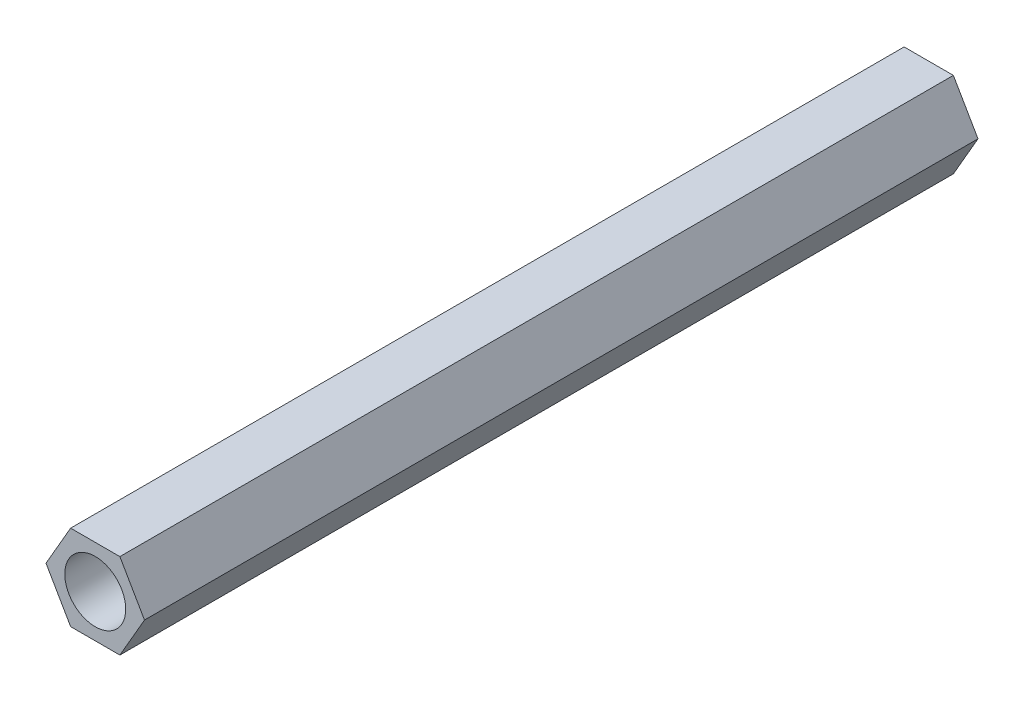
ISO-10303-21;
HEADER;
FILE_DESCRIPTION(('STEP AP214'),'2;1');
FILE_NAME('part.step','',(''),(''),'','','');
FILE_SCHEMA(('AUTOMOTIVE_DESIGN { 1 0 10303 214 1 1 1 1 }'));
ENDSEC;
DATA;
#1=APPLICATION_CONTEXT('core data for automotive mechanical design processes');
#2=APPLICATION_PROTOCOL_DEFINITION('international standard','automotive_design',2000,#1);
#3=PRODUCT_CONTEXT('',#1,'mechanical');
#4=PRODUCT('Part','Part','',(#3));
#5=PRODUCT_RELATED_PRODUCT_CATEGORY('part','',(#4));
#6=PRODUCT_DEFINITION_FORMATION('','',#4);
#7=PRODUCT_DEFINITION_CONTEXT('part definition',#1,'design');
#8=PRODUCT_DEFINITION('design','',#6,#7);
#9=PRODUCT_DEFINITION_SHAPE('','',#8);
#10=(LENGTH_UNIT() NAMED_UNIT(*) SI_UNIT(.MILLI.,.METRE.));
#11=(NAMED_UNIT(*) PLANE_ANGLE_UNIT() SI_UNIT($,.RADIAN.));
#12=(NAMED_UNIT(*) SI_UNIT($,.STERADIAN.) SOLID_ANGLE_UNIT());
#13=UNCERTAINTY_MEASURE_WITH_UNIT(LENGTH_MEASURE(1.E-05),#10,'distance_accuracy_value','');
#14=(GEOMETRIC_REPRESENTATION_CONTEXT(3) GLOBAL_UNCERTAINTY_ASSIGNED_CONTEXT((#13)) GLOBAL_UNIT_ASSIGNED_CONTEXT((#10,
#11,#12)) REPRESENTATION_CONTEXT('',''));
#15=CARTESIAN_POINT('',(0.,0.,0.));
#16=DIRECTION('',(0.,0.,1.));
#17=DIRECTION('',(1.,0.,0.));
#18=AXIS2_PLACEMENT_3D('',#15,#16,#17);
#19=CARTESIAN_POINT('',(0.,0.,34.2));
#20=DIRECTION('',(0.,0.,1.));
#21=DIRECTION('',(1.,0.,0.));
#22=AXIS2_PLACEMENT_3D('',#19,#20,#21);
#23=PLANE('',#22);
#24=DIRECTION('',(-0.5,-0.866025403784439,0.));
#25=VECTOR('',#24,1.);
#26=CARTESIAN_POINT('',(-2.02072594216369,3.5,34.2));
#27=LINE('',#26,#25);
#28=CARTESIAN_POINT('',(-2.02072594216369,3.5,34.2));
#29=VERTEX_POINT('',#28);
#30=CARTESIAN_POINT('',(-4.04145188432738,0.,34.2));
#31=VERTEX_POINT('',#30);
#32=EDGE_CURVE('E129',#29,#31,#27,.T.);
#33=ORIENTED_EDGE('',*,*,#32,.T.);
#34=DIRECTION('',(0.5,-0.866025403784439,0.));
#35=VECTOR('',#34,1.);
#36=CARTESIAN_POINT('',(-4.04145188432738,0.,34.2));
#37=LINE('',#36,#35);
#38=CARTESIAN_POINT('',(-2.02072594216369,-3.5,34.2));
#39=VERTEX_POINT('',#38);
#40=EDGE_CURVE('E87',#31,#39,#37,.T.);
#41=ORIENTED_EDGE('',*,*,#40,.T.);
#42=DIRECTION('',(1.,0.,0.));
#43=VECTOR('',#42,1.);
#44=CARTESIAN_POINT('',(-2.02072594216369,-3.5,34.2));
#45=LINE('',#44,#43);
#46=CARTESIAN_POINT('',(2.02072594216369,-3.5,34.2));
#47=VERTEX_POINT('',#46);
#48=EDGE_CURVE('E100',#39,#47,#45,.T.);
#49=ORIENTED_EDGE('',*,*,#48,.T.);
#50=DIRECTION('',(0.5,0.866025403784439,0.));
#51=VECTOR('',#50,1.);
#52=CARTESIAN_POINT('',(2.02072594216369,-3.5,34.2));
#53=LINE('',#52,#51);
#54=CARTESIAN_POINT('',(4.04145188432738,0.,34.2));
#55=VERTEX_POINT('',#54);
#56=EDGE_CURVE('E94',#47,#55,#53,.T.);
#57=ORIENTED_EDGE('',*,*,#56,.T.);
#58=DIRECTION('',(-0.5,0.866025403784439,0.));
#59=VECTOR('',#58,1.);
#60=CARTESIAN_POINT('',(4.04145188432738,0.,34.2));
#61=LINE('',#60,#59);
#62=CARTESIAN_POINT('',(2.02072594216369,3.5,34.2));
#63=VERTEX_POINT('',#62);
#64=EDGE_CURVE('E98',#55,#63,#61,.T.);
#65=ORIENTED_EDGE('',*,*,#64,.T.);
#66=DIRECTION('',(-1.,0.,0.));
#67=VECTOR('',#66,1.);
#68=CARTESIAN_POINT('',(2.02072594216369,3.5,34.2));
#69=LINE('',#68,#67);
#70=EDGE_CURVE('E50',#63,#29,#69,.T.);
#71=ORIENTED_EDGE('',*,*,#70,.T.);
#72=EDGE_LOOP('',(#33,#41,#49,#57,#65,#71));
#73=FACE_BOUND('',#72,.T.);
#74=CARTESIAN_POINT('',(0.,0.,34.2));
#75=DIRECTION('',(0.,0.,1.));
#76=DIRECTION('',(1.,0.,0.));
#77=AXIS2_PLACEMENT_3D('',#74,#75,#76);
#78=CIRCLE('',#77,2.5);
#79=CARTESIAN_POINT('',(2.5,0.,34.2));
#80=VERTEX_POINT('',#79);
#81=EDGE_CURVE('E122',#80,#80,#78,.T.);
#82=ORIENTED_EDGE('',*,*,#81,.F.);
#83=EDGE_LOOP('',(#82));
#84=FACE_BOUND('',#83,.T.);
#85=ADVANCED_FACE('F33',(#73,#84),#23,.T.);
#86=CARTESIAN_POINT('',(0.,0.,-34.2));
#87=DIRECTION('',(0.,0.,1.));
#88=DIRECTION('',(1.,0.,0.));
#89=AXIS2_PLACEMENT_3D('',#86,#87,#88);
#90=PLANE('',#89);
#91=DIRECTION('',(-0.5,-0.866025403784439,0.));
#92=VECTOR('',#91,1.);
#93=CARTESIAN_POINT('',(-2.02072594216369,3.5,-34.2));
#94=LINE('',#93,#92);
#95=CARTESIAN_POINT('',(-2.02072594216369,3.5,-34.2));
#96=VERTEX_POINT('',#95);
#97=CARTESIAN_POINT('',(-4.04145188432738,0.,-34.2));
#98=VERTEX_POINT('',#97);
#99=EDGE_CURVE('E118',#96,#98,#94,.T.);
#100=ORIENTED_EDGE('',*,*,#99,.F.);
#101=DIRECTION('',(-1.,0.,0.));
#102=VECTOR('',#101,1.);
#103=CARTESIAN_POINT('',(2.02072594216369,3.5,-34.2));
#104=LINE('',#103,#102);
#105=CARTESIAN_POINT('',(2.02072594216369,3.5,-34.2));
#106=VERTEX_POINT('',#105);
#107=EDGE_CURVE('E79',#106,#96,#104,.T.);
#108=ORIENTED_EDGE('',*,*,#107,.F.);
#109=DIRECTION('',(-0.5,0.866025403784439,0.));
#110=VECTOR('',#109,1.);
#111=CARTESIAN_POINT('',(4.04145188432738,0.,-34.2));
#112=LINE('',#111,#110);
#113=CARTESIAN_POINT('',(4.04145188432738,0.,-34.2));
#114=VERTEX_POINT('',#113);
#115=EDGE_CURVE('E73',#114,#106,#112,.T.);
#116=ORIENTED_EDGE('',*,*,#115,.F.);
#117=DIRECTION('',(0.5,0.866025403784439,0.));
#118=VECTOR('',#117,1.);
#119=CARTESIAN_POINT('',(2.02072594216369,-3.5,-34.2));
#120=LINE('',#119,#118);
#121=CARTESIAN_POINT('',(2.02072594216369,-3.5,-34.2));
#122=VERTEX_POINT('',#121);
#123=EDGE_CURVE('E108',#122,#114,#120,.T.);
#124=ORIENTED_EDGE('',*,*,#123,.F.);
#125=DIRECTION('',(1.,0.,0.));
#126=VECTOR('',#125,1.);
#127=CARTESIAN_POINT('',(-2.02072594216369,-3.5,-34.2));
#128=LINE('',#127,#126);
#129=CARTESIAN_POINT('',(-2.02072594216369,-3.5,-34.2));
#130=VERTEX_POINT('',#129);
#131=EDGE_CURVE('E124',#130,#122,#128,.T.);
#132=ORIENTED_EDGE('',*,*,#131,.F.);
#133=DIRECTION('',(0.5,-0.866025403784439,0.));
#134=VECTOR('',#133,1.);
#135=CARTESIAN_POINT('',(-4.04145188432738,0.,-34.2));
#136=LINE('',#135,#134);
#137=EDGE_CURVE('E121',#98,#130,#136,.T.);
#138=ORIENTED_EDGE('',*,*,#137,.F.);
#139=EDGE_LOOP('',(#100,#108,#116,#124,#132,#138));
#140=FACE_BOUND('',#139,.T.);
#141=CARTESIAN_POINT('',(0.,0.,-34.2));
#142=DIRECTION('',(0.,0.,1.));
#143=DIRECTION('',(1.,0.,0.));
#144=AXIS2_PLACEMENT_3D('',#141,#142,#143);
#145=CIRCLE('',#144,2.5);
#146=CARTESIAN_POINT('',(2.5,0.,-34.2));
#147=VERTEX_POINT('',#146);
#148=EDGE_CURVE('E222',#147,#147,#145,.T.);
#149=ORIENTED_EDGE('',*,*,#148,.T.);
#150=EDGE_LOOP('',(#149));
#151=FACE_BOUND('',#150,.T.);
#152=ADVANCED_FACE('F138',(#140,#151),#90,.F.);
#153=CARTESIAN_POINT('',(-2.02072594216369,3.5,34.2));
#154=DIRECTION('',(0.866025403784439,-0.5,0.));
#155=DIRECTION('',(0.5,0.866025403784439,0.));
#156=AXIS2_PLACEMENT_3D('',#153,#154,#155);
#157=PLANE('',#156);
#158=ORIENTED_EDGE('',*,*,#99,.T.);
#159=DIRECTION('',(0.,0.,-1.));
#160=VECTOR('',#159,1.);
#161=CARTESIAN_POINT('',(-4.04145188432738,0.,34.2));
#162=LINE('',#161,#160);
#163=EDGE_CURVE('E11',#31,#98,#162,.T.);
#164=ORIENTED_EDGE('',*,*,#163,.F.);
#165=ORIENTED_EDGE('',*,*,#32,.F.);
#166=DIRECTION('',(0.,0.,-1.));
#167=VECTOR('',#166,1.);
#168=CARTESIAN_POINT('',(-2.02072594216369,3.5,34.2));
#169=LINE('',#168,#167);
#170=EDGE_CURVE('E114',#29,#96,#169,.T.);
#171=ORIENTED_EDGE('',*,*,#170,.T.);
#172=EDGE_LOOP('',(#158,#164,#165,#171));
#173=FACE_BOUND('',#172,.T.);
#174=ADVANCED_FACE('F35',(#173),#157,.F.);
#175=CARTESIAN_POINT('',(-4.04145188432738,0.,34.2));
#176=DIRECTION('',(0.866025403784439,0.5,0.));
#177=DIRECTION('',(-0.5,0.866025403784439,0.));
#178=AXIS2_PLACEMENT_3D('',#175,#176,#177);
#179=PLANE('',#178);
#180=ORIENTED_EDGE('',*,*,#137,.T.);
#181=DIRECTION('',(0.,0.,-1.));
#182=VECTOR('',#181,1.);
#183=CARTESIAN_POINT('',(-2.02072594216369,-3.5,34.2));
#184=LINE('',#183,#182);
#185=EDGE_CURVE('E42',#39,#130,#184,.T.);
#186=ORIENTED_EDGE('',*,*,#185,.F.);
#187=ORIENTED_EDGE('',*,*,#40,.F.);
#188=ORIENTED_EDGE('',*,*,#163,.T.);
#189=EDGE_LOOP('',(#180,#186,#187,#188));
#190=FACE_BOUND('',#189,.T.);
#191=ADVANCED_FACE('F163',(#190),#179,.F.);
#192=CARTESIAN_POINT('',(-2.02072594216369,-3.5,34.2));
#193=DIRECTION('',(0.,1.,0.));
#194=DIRECTION('',(0.,0.,1.));
#195=AXIS2_PLACEMENT_3D('',#192,#193,#194);
#196=PLANE('',#195);
#197=ORIENTED_EDGE('',*,*,#131,.T.);
#198=DIRECTION('',(0.,0.,-1.));
#199=VECTOR('',#198,1.);
#200=CARTESIAN_POINT('',(2.02072594216369,-3.5,34.2));
#201=LINE('',#200,#199);
#202=EDGE_CURVE('E109',#47,#122,#201,.T.);
#203=ORIENTED_EDGE('',*,*,#202,.F.);
#204=ORIENTED_EDGE('',*,*,#48,.F.);
#205=ORIENTED_EDGE('',*,*,#185,.T.);
#206=EDGE_LOOP('',(#197,#203,#204,#205));
#207=FACE_BOUND('',#206,.T.);
#208=ADVANCED_FACE('F135',(#207),#196,.F.);
#209=CARTESIAN_POINT('',(2.02072594216369,-3.5,34.2));
#210=DIRECTION('',(-0.866025403784439,0.5,0.));
#211=DIRECTION('',(-0.5,-0.866025403784439,0.));
#212=AXIS2_PLACEMENT_3D('',#209,#210,#211);
#213=PLANE('',#212);
#214=ORIENTED_EDGE('',*,*,#123,.T.);
#215=DIRECTION('',(0.,0.,-1.));
#216=VECTOR('',#215,1.);
#217=CARTESIAN_POINT('',(4.04145188432738,0.,34.2));
#218=LINE('',#217,#216);
#219=EDGE_CURVE('E105',#55,#114,#218,.T.);
#220=ORIENTED_EDGE('',*,*,#219,.F.);
#221=ORIENTED_EDGE('',*,*,#56,.F.);
#222=ORIENTED_EDGE('',*,*,#202,.T.);
#223=EDGE_LOOP('',(#214,#220,#221,#222));
#224=FACE_BOUND('',#223,.T.);
#225=ADVANCED_FACE('F106',(#224),#213,.F.);
#226=CARTESIAN_POINT('',(4.04145188432738,0.,34.2));
#227=DIRECTION('',(-0.866025403784438,-0.5,0.));
#228=DIRECTION('',(0.5,-0.866025403784439,0.));
#229=AXIS2_PLACEMENT_3D('',#226,#227,#228);
#230=PLANE('',#229);
#231=ORIENTED_EDGE('',*,*,#115,.T.);
#232=DIRECTION('',(0.,0.,-1.));
#233=VECTOR('',#232,1.);
#234=CARTESIAN_POINT('',(2.02072594216369,3.5,34.2));
#235=LINE('',#234,#233);
#236=EDGE_CURVE('E110',#63,#106,#235,.T.);
#237=ORIENTED_EDGE('',*,*,#236,.F.);
#238=ORIENTED_EDGE('',*,*,#64,.F.);
#239=ORIENTED_EDGE('',*,*,#219,.T.);
#240=EDGE_LOOP('',(#231,#237,#238,#239));
#241=FACE_BOUND('',#240,.T.);
#242=ADVANCED_FACE('F112',(#241),#230,.F.);
#243=CARTESIAN_POINT('',(2.02072594216369,3.5,34.2));
#244=DIRECTION('',(0.,-1.,0.));
#245=DIRECTION('',(0.,0.,-1.));
#246=AXIS2_PLACEMENT_3D('',#243,#244,#245);
#247=PLANE('',#246);
#248=ORIENTED_EDGE('',*,*,#107,.T.);
#249=ORIENTED_EDGE('',*,*,#170,.F.);
#250=ORIENTED_EDGE('',*,*,#70,.F.);
#251=ORIENTED_EDGE('',*,*,#236,.T.);
#252=EDGE_LOOP('',(#248,#249,#250,#251));
#253=FACE_BOUND('',#252,.T.);
#254=ADVANCED_FACE('F143',(#253),#247,.F.);
#255=CARTESIAN_POINT('',(0.,0.,34.2));
#256=DIRECTION('',(0.,0.,-1.));
#257=DIRECTION('',(-1.,0.,0.));
#258=AXIS2_PLACEMENT_3D('',#255,#256,#257);
#259=CYLINDRICAL_SURFACE('',#258,2.5);
#260=ORIENTED_EDGE('',*,*,#81,.T.);
#261=EDGE_LOOP('',(#260));
#262=FACE_BOUND('',#261,.T.);
#263=ORIENTED_EDGE('',*,*,#148,.F.);
#264=EDGE_LOOP('',(#263));
#265=FACE_BOUND('',#264,.T.);
#266=ADVANCED_FACE('F145',(#262,#265),#259,.F.);
#267=CLOSED_SHELL('',(#85,#152,#174,#191,#208,#225,#242,#254,#266));
#268=MANIFOLD_SOLID_BREP('B2',#267);
#269=ADVANCED_BREP_SHAPE_REPRESENTATION('',(#18,#268),#14);
#270=SHAPE_DEFINITION_REPRESENTATION(#9,#269);
ENDSEC;
END-ISO-10303-21;
